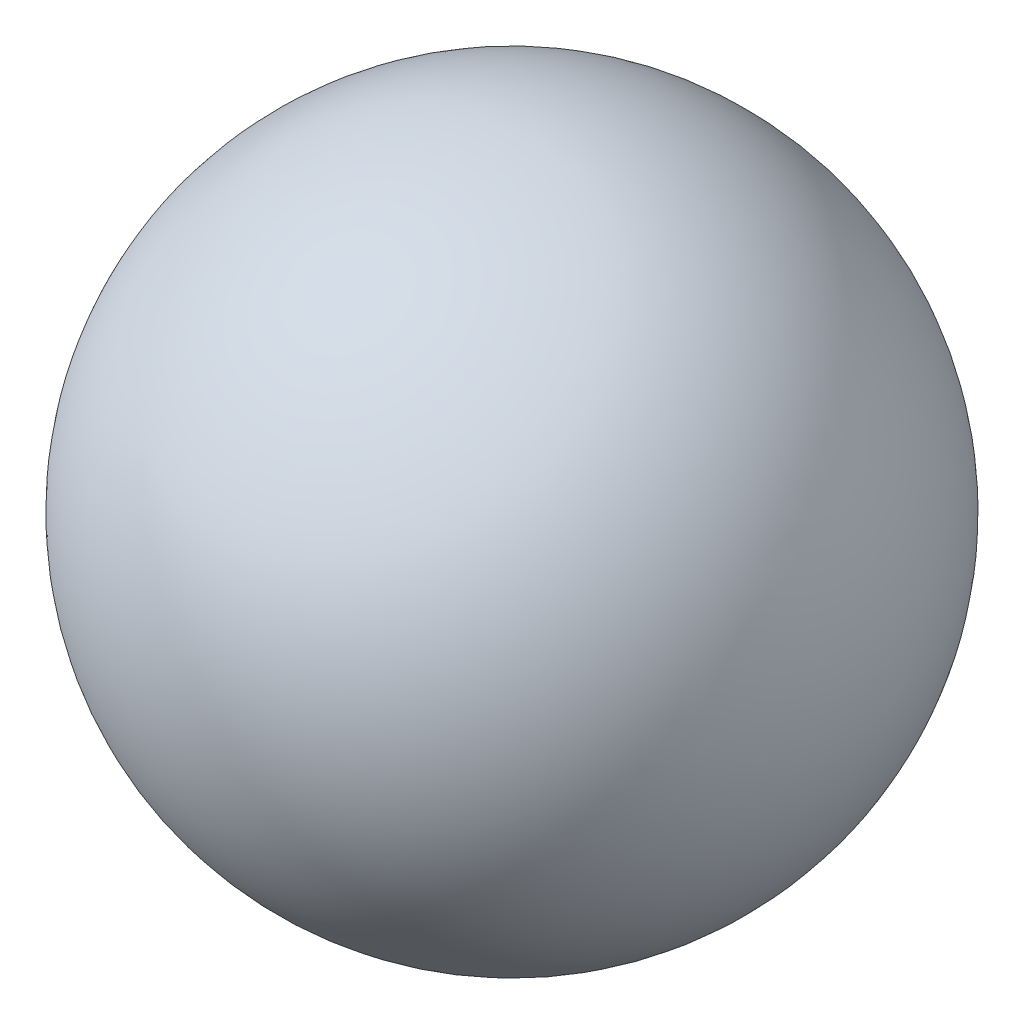
ISO-10303-21;
HEADER;
FILE_DESCRIPTION(('STEP AP214'),'2;1');
FILE_NAME('part.step','',(''),(''),'','','');
FILE_SCHEMA(('AUTOMOTIVE_DESIGN { 1 0 10303 214 1 1 1 1 }'));
ENDSEC;
DATA;
#1=APPLICATION_CONTEXT('core data for automotive mechanical design processes');
#2=APPLICATION_PROTOCOL_DEFINITION('international standard','automotive_design',2000,#1);
#3=PRODUCT_CONTEXT('',#1,'mechanical');
#4=PRODUCT('Part','Part','',(#3));
#5=PRODUCT_RELATED_PRODUCT_CATEGORY('part','',(#4));
#6=PRODUCT_DEFINITION_FORMATION('','',#4);
#7=PRODUCT_DEFINITION_CONTEXT('part definition',#1,'design');
#8=PRODUCT_DEFINITION('design','',#6,#7);
#9=PRODUCT_DEFINITION_SHAPE('','',#8);
#10=(LENGTH_UNIT() NAMED_UNIT(*) SI_UNIT(.MILLI.,.METRE.));
#11=(NAMED_UNIT(*) PLANE_ANGLE_UNIT() SI_UNIT($,.RADIAN.));
#12=(NAMED_UNIT(*) SI_UNIT($,.STERADIAN.) SOLID_ANGLE_UNIT());
#13=UNCERTAINTY_MEASURE_WITH_UNIT(LENGTH_MEASURE(1.E-05),#10,'distance_accuracy_value','');
#14=(GEOMETRIC_REPRESENTATION_CONTEXT(3) GLOBAL_UNCERTAINTY_ASSIGNED_CONTEXT((#13)) GLOBAL_UNIT_ASSIGNED_CONTEXT((#10,
#11,#12)) REPRESENTATION_CONTEXT('',''));
#15=CARTESIAN_POINT('',(0.,0.,0.));
#16=DIRECTION('',(0.,0.,1.));
#17=DIRECTION('',(1.,0.,0.));
#18=AXIS2_PLACEMENT_3D('',#15,#16,#17);
#19=CARTESIAN_POINT('',(0.,0.,0.));
#20=DIRECTION('',(-1.,0.,0.));
#21=DIRECTION('',(0.,1.,0.));
#22=AXIS2_PLACEMENT_3D('',#19,#20,#21);
#23=SPHERICAL_SURFACE('',#22,21.5);
#24=CARTESIAN_POINT('',(-21.5,0.,0.));
#25=VERTEX_POINT('',#24);
#26=VERTEX_LOOP('',#25);
#27=FACE_BOUND('',#26,.T.);
#28=ADVANCED_FACE('F33',(#27),#23,.T.);
#29=CLOSED_SHELL('',(#28));
#30=MANIFOLD_SOLID_BREP('B2',#29);
#31=ADVANCED_BREP_SHAPE_REPRESENTATION('',(#18,#30),#14);
#32=SHAPE_DEFINITION_REPRESENTATION(#9,#31);
ENDSEC;
END-ISO-10303-21;
